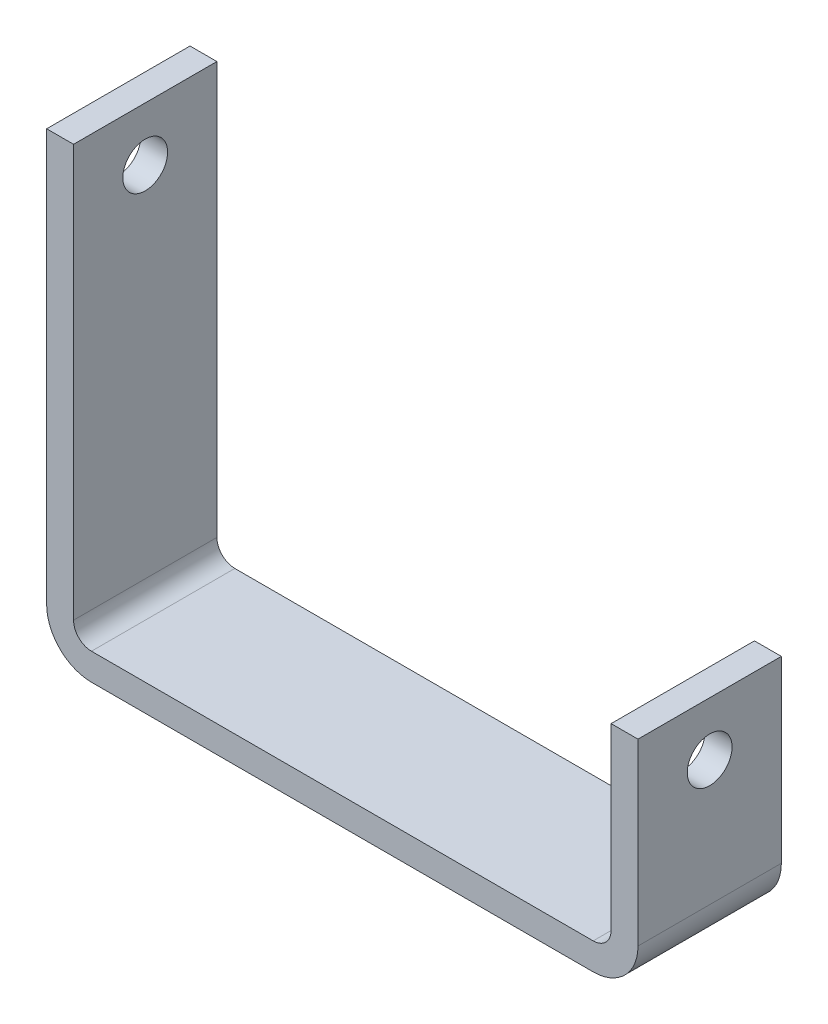
ISO-10303-21;
HEADER;
FILE_DESCRIPTION(('STEP AP214'),'2;1');
FILE_NAME('part.step','',(''),(''),'','','');
FILE_SCHEMA(('AUTOMOTIVE_DESIGN { 1 0 10303 214 1 1 1 1 }'));
ENDSEC;
DATA;
#1=APPLICATION_CONTEXT('core data for automotive mechanical design processes');
#2=APPLICATION_PROTOCOL_DEFINITION('international standard','automotive_design',2000,#1);
#3=PRODUCT_CONTEXT('',#1,'mechanical');
#4=PRODUCT('Part','Part','',(#3));
#5=PRODUCT_RELATED_PRODUCT_CATEGORY('part','',(#4));
#6=PRODUCT_DEFINITION_FORMATION('','',#4);
#7=PRODUCT_DEFINITION_CONTEXT('part definition',#1,'design');
#8=PRODUCT_DEFINITION('design','',#6,#7);
#9=PRODUCT_DEFINITION_SHAPE('','',#8);
#10=(LENGTH_UNIT() NAMED_UNIT(*) SI_UNIT(.MILLI.,.METRE.));
#11=(NAMED_UNIT(*) PLANE_ANGLE_UNIT() SI_UNIT($,.RADIAN.));
#12=(NAMED_UNIT(*) SI_UNIT($,.STERADIAN.) SOLID_ANGLE_UNIT());
#13=UNCERTAINTY_MEASURE_WITH_UNIT(LENGTH_MEASURE(1.E-05),#10,'distance_accuracy_value','');
#14=(GEOMETRIC_REPRESENTATION_CONTEXT(3) GLOBAL_UNCERTAINTY_ASSIGNED_CONTEXT((#13)) GLOBAL_UNIT_ASSIGNED_CONTEXT((#10,
#11,#12)) REPRESENTATION_CONTEXT('',''));
#15=CARTESIAN_POINT('',(0.,0.,0.));
#16=DIRECTION('',(0.,0.,1.));
#17=DIRECTION('',(1.,0.,0.));
#18=AXIS2_PLACEMENT_3D('',#15,#16,#17);
#19=CARTESIAN_POINT('',(0.,5.,20.));
#20=DIRECTION('',(-1.,0.,0.));
#21=DIRECTION('',(0.,0.,1.));
#22=AXIS2_PLACEMENT_3D('',#19,#20,#21);
#23=PLANE('',#22);
#24=CARTESIAN_POINT('',(0.,105.,0.));
#25=DIRECTION('',(-1.,0.,0.));
#26=DIRECTION('',(0.,0.,1.));
#27=AXIS2_PLACEMENT_3D('',#24,#25,#26);
#28=CIRCLE('',#27,6.25);
#29=CARTESIAN_POINT('',(0.,105.,-6.25));
#30=VERTEX_POINT('',#29);
#31=EDGE_CURVE('E266',#30,#30,#28,.T.);
#32=ORIENTED_EDGE('',*,*,#31,.T.);
#33=EDGE_LOOP('',(#32));
#34=FACE_BOUND('',#33,.T.);
#35=DIRECTION('',(0.,1.,0.));
#36=VECTOR('',#35,1.);
#37=CARTESIAN_POINT('',(0.,5.,-20.));
#38=LINE('',#37,#36);
#39=CARTESIAN_POINT('',(0.,5.,-20.));
#40=VERTEX_POINT('',#39);
#41=CARTESIAN_POINT('',(0.,120.,-20.));
#42=VERTEX_POINT('',#41);
#43=EDGE_CURVE('E154',#40,#42,#38,.T.);
#44=ORIENTED_EDGE('',*,*,#43,.T.);
#45=DIRECTION('',(0.,0.,-1.));
#46=VECTOR('',#45,1.);
#47=CARTESIAN_POINT('',(0.,120.,20.));
#48=LINE('',#47,#46);
#49=CARTESIAN_POINT('',(0.,120.,20.));
#50=VERTEX_POINT('',#49);
#51=EDGE_CURVE('E11',#50,#42,#48,.T.);
#52=ORIENTED_EDGE('',*,*,#51,.F.);
#53=DIRECTION('',(0.,1.,0.));
#54=VECTOR('',#53,1.);
#55=CARTESIAN_POINT('',(0.,5.,20.));
#56=LINE('',#55,#54);
#57=CARTESIAN_POINT('',(0.,5.,20.));
#58=VERTEX_POINT('',#57);
#59=EDGE_CURVE('E102',#58,#50,#56,.T.);
#60=ORIENTED_EDGE('',*,*,#59,.F.);
#61=DIRECTION('',(0.,0.,-1.));
#62=VECTOR('',#61,1.);
#63=CARTESIAN_POINT('',(0.,5.,20.));
#64=LINE('',#63,#62);
#65=EDGE_CURVE('E150',#58,#40,#64,.T.);
#66=ORIENTED_EDGE('',*,*,#65,.T.);
#67=EDGE_LOOP('',(#44,#52,#60,#66));
#68=FACE_BOUND('',#67,.T.);
#69=ADVANCED_FACE('F34',(#34,#68),#23,.F.);
#70=CARTESIAN_POINT('',(-7.5,120.,20.));
#71=DIRECTION('',(0.,1.,0.));
#72=DIRECTION('',(0.,0.,1.));
#73=AXIS2_PLACEMENT_3D('',#70,#71,#72);
#74=PLANE('',#73);
#75=DIRECTION('',(1.,0.,0.));
#76=VECTOR('',#75,1.);
#77=CARTESIAN_POINT('',(-7.5,120.,-20.));
#78=LINE('',#77,#76);
#79=CARTESIAN_POINT('',(-7.5,120.,-20.));
#80=VERTEX_POINT('',#79);
#81=EDGE_CURVE('E157',#80,#42,#78,.T.);
#82=ORIENTED_EDGE('',*,*,#81,.F.);
#83=DIRECTION('',(0.,0.,-1.));
#84=VECTOR('',#83,1.);
#85=CARTESIAN_POINT('',(-7.5,120.,20.));
#86=LINE('',#85,#84);
#87=CARTESIAN_POINT('',(-7.5,120.,20.));
#88=VERTEX_POINT('',#87);
#89=EDGE_CURVE('E42',#88,#80,#86,.T.);
#90=ORIENTED_EDGE('',*,*,#89,.F.);
#91=DIRECTION('',(1.,0.,0.));
#92=VECTOR('',#91,1.);
#93=CARTESIAN_POINT('',(-7.5,120.,20.));
#94=LINE('',#93,#92);
#95=EDGE_CURVE('E220',#88,#50,#94,.T.);
#96=ORIENTED_EDGE('',*,*,#95,.T.);
#97=ORIENTED_EDGE('',*,*,#51,.T.);
#98=EDGE_LOOP('',(#82,#90,#96,#97));
#99=FACE_BOUND('',#98,.T.);
#100=ADVANCED_FACE('F207',(#99),#74,.T.);
#101=CARTESIAN_POINT('',(-7.5,5.,20.));
#102=DIRECTION('',(-1.,0.,0.));
#103=DIRECTION('',(0.,0.,1.));
#104=AXIS2_PLACEMENT_3D('',#101,#102,#103);
#105=PLANE('',#104);
#106=CARTESIAN_POINT('',(-7.5,105.,0.));
#107=DIRECTION('',(-1.,0.,0.));
#108=DIRECTION('',(0.,0.,1.));
#109=AXIS2_PLACEMENT_3D('',#106,#107,#108);
#110=CIRCLE('',#109,6.25);
#111=CARTESIAN_POINT('',(-7.5,105.,-6.25));
#112=VERTEX_POINT('',#111);
#113=EDGE_CURVE('E158',#112,#112,#110,.T.);
#114=ORIENTED_EDGE('',*,*,#113,.F.);
#115=EDGE_LOOP('',(#114));
#116=FACE_BOUND('',#115,.T.);
#117=DIRECTION('',(0.,1.,0.));
#118=VECTOR('',#117,1.);
#119=CARTESIAN_POINT('',(-7.5,5.,-20.));
#120=LINE('',#119,#118);
#121=CARTESIAN_POINT('',(-7.5,5.,-20.));
#122=VERTEX_POINT('',#121);
#123=EDGE_CURVE('E161',#122,#80,#120,.T.);
#124=ORIENTED_EDGE('',*,*,#123,.F.);
#125=DIRECTION('',(0.,0.,-1.));
#126=VECTOR('',#125,1.);
#127=CARTESIAN_POINT('',(-7.5,5.,20.));
#128=LINE('',#127,#126);
#129=CARTESIAN_POINT('',(-7.5,5.,20.));
#130=VERTEX_POINT('',#129);
#131=EDGE_CURVE('E197',#130,#122,#128,.T.);
#132=ORIENTED_EDGE('',*,*,#131,.F.);
#133=DIRECTION('',(0.,1.,0.));
#134=VECTOR('',#133,1.);
#135=CARTESIAN_POINT('',(-7.5,5.,20.));
#136=LINE('',#135,#134);
#137=EDGE_CURVE('E204',#130,#88,#136,.T.);
#138=ORIENTED_EDGE('',*,*,#137,.T.);
#139=ORIENTED_EDGE('',*,*,#89,.T.);
#140=EDGE_LOOP('',(#124,#132,#138,#139));
#141=FACE_BOUND('',#140,.T.);
#142=ADVANCED_FACE('F202',(#116,#141),#105,.T.);
#143=CARTESIAN_POINT('',(5.,5.,20.));
#144=DIRECTION('',(0.,0.,-1.));
#145=DIRECTION('',(-1.,0.,0.));
#146=AXIS2_PLACEMENT_3D('',#143,#144,#145);
#147=CYLINDRICAL_SURFACE('',#146,12.5);
#148=CARTESIAN_POINT('',(5.,5.,-20.));
#149=DIRECTION('',(0.,0.,1.));
#150=DIRECTION('',(1.,0.,0.));
#151=AXIS2_PLACEMENT_3D('',#148,#149,#150);
#152=CIRCLE('',#151,12.5);
#153=CARTESIAN_POINT('',(5.,-7.5,-20.));
#154=VERTEX_POINT('',#153);
#155=EDGE_CURVE('E164',#154,#122,#152,.F.);
#156=ORIENTED_EDGE('',*,*,#155,.F.);
#157=DIRECTION('',(0.,0.,-1.));
#158=VECTOR('',#157,1.);
#159=CARTESIAN_POINT('',(5.,-7.5,20.));
#160=LINE('',#159,#158);
#161=CARTESIAN_POINT('',(5.,-7.5,20.));
#162=VERTEX_POINT('',#161);
#163=EDGE_CURVE('E195',#162,#154,#160,.T.);
#164=ORIENTED_EDGE('',*,*,#163,.F.);
#165=CARTESIAN_POINT('',(5.,5.,20.));
#166=DIRECTION('',(0.,0.,1.));
#167=DIRECTION('',(1.,0.,0.));
#168=AXIS2_PLACEMENT_3D('',#165,#166,#167);
#169=CIRCLE('',#168,12.5);
#170=EDGE_CURVE('E217',#162,#130,#169,.F.);
#171=ORIENTED_EDGE('',*,*,#170,.T.);
#172=ORIENTED_EDGE('',*,*,#131,.T.);
#173=EDGE_LOOP('',(#156,#164,#171,#172));
#174=FACE_BOUND('',#173,.T.);
#175=ADVANCED_FACE('F214',(#174),#147,.T.);
#176=CARTESIAN_POINT('',(5.,-7.5,20.));
#177=DIRECTION('',(0.,-1.,0.));
#178=DIRECTION('',(0.,0.,-1.));
#179=AXIS2_PLACEMENT_3D('',#176,#177,#178);
#180=PLANE('',#179);
#181=DIRECTION('',(1.,0.,0.));
#182=VECTOR('',#181,1.);
#183=CARTESIAN_POINT('',(5.,-7.5,-20.));
#184=LINE('',#183,#182);
#185=CARTESIAN_POINT('',(145.,-7.5,-20.));
#186=VERTEX_POINT('',#185);
#187=EDGE_CURVE('E167',#186,#154,#184,.F.);
#188=ORIENTED_EDGE('',*,*,#187,.F.);
#189=DIRECTION('',(0.,0.,-1.));
#190=VECTOR('',#189,1.);
#191=CARTESIAN_POINT('',(145.,-7.5,20.));
#192=LINE('',#191,#190);
#193=CARTESIAN_POINT('',(145.,-7.5,20.));
#194=VERTEX_POINT('',#193);
#195=EDGE_CURVE('E193',#194,#186,#192,.T.);
#196=ORIENTED_EDGE('',*,*,#195,.F.);
#197=DIRECTION('',(1.,0.,0.));
#198=VECTOR('',#197,1.);
#199=CARTESIAN_POINT('',(5.,-7.5,20.));
#200=LINE('',#199,#198);
#201=EDGE_CURVE('E222',#194,#162,#200,.F.);
#202=ORIENTED_EDGE('',*,*,#201,.T.);
#203=ORIENTED_EDGE('',*,*,#163,.T.);
#204=EDGE_LOOP('',(#188,#196,#202,#203));
#205=FACE_BOUND('',#204,.T.);
#206=ADVANCED_FACE('F307',(#205),#180,.T.);
#207=CARTESIAN_POINT('',(145.,5.,20.));
#208=DIRECTION('',(0.,0.,-1.));
#209=DIRECTION('',(-1.,0.,0.));
#210=AXIS2_PLACEMENT_3D('',#207,#208,#209);
#211=CYLINDRICAL_SURFACE('',#210,12.5);
#212=CARTESIAN_POINT('',(145.,5.,-20.));
#213=DIRECTION('',(0.,0.,1.));
#214=DIRECTION('',(1.,0.,0.));
#215=AXIS2_PLACEMENT_3D('',#212,#213,#214);
#216=CIRCLE('',#215,12.5);
#217=CARTESIAN_POINT('',(157.5,5.,-20.));
#218=VERTEX_POINT('',#217);
#219=EDGE_CURVE('E170',#218,#186,#216,.F.);
#220=ORIENTED_EDGE('',*,*,#219,.F.);
#221=DIRECTION('',(0.,0.,-1.));
#222=VECTOR('',#221,1.);
#223=CARTESIAN_POINT('',(157.5,5.,20.));
#224=LINE('',#223,#222);
#225=CARTESIAN_POINT('',(157.5,5.,20.));
#226=VERTEX_POINT('',#225);
#227=EDGE_CURVE('E191',#226,#218,#224,.T.);
#228=ORIENTED_EDGE('',*,*,#227,.F.);
#229=CARTESIAN_POINT('',(145.,5.,20.));
#230=DIRECTION('',(0.,0.,1.));
#231=DIRECTION('',(1.,0.,0.));
#232=AXIS2_PLACEMENT_3D('',#229,#230,#231);
#233=CIRCLE('',#232,12.5);
#234=EDGE_CURVE('E228',#226,#194,#233,.F.);
#235=ORIENTED_EDGE('',*,*,#234,.T.);
#236=ORIENTED_EDGE('',*,*,#195,.T.);
#237=EDGE_LOOP('',(#220,#228,#235,#236));
#238=FACE_BOUND('',#237,.T.);
#239=ADVANCED_FACE('F312',(#238),#211,.T.);
#240=CARTESIAN_POINT('',(157.5,4.99999999999998,20.));
#241=DIRECTION('',(1.,0.,0.));
#242=DIRECTION('',(0.,1.,0.));
#243=AXIS2_PLACEMENT_3D('',#240,#241,#242);
#244=PLANE('',#243);
#245=CARTESIAN_POINT('',(157.5,39.9999999999999,0.));
#246=DIRECTION('',(1.,0.,0.));
#247=DIRECTION('',(0.,1.,0.));
#248=AXIS2_PLACEMENT_3D('',#245,#246,#247);
#249=CIRCLE('',#248,6.25);
#250=CARTESIAN_POINT('',(157.5,46.2499999999999,0.));
#251=VERTEX_POINT('',#250);
#252=EDGE_CURVE('E291',#251,#251,#249,.T.);
#253=ORIENTED_EDGE('',*,*,#252,.F.);
#254=EDGE_LOOP('',(#253));
#255=FACE_BOUND('',#254,.T.);
#256=DIRECTION('',(0.,-1.,0.));
#257=VECTOR('',#256,1.);
#258=CARTESIAN_POINT('',(157.5,4.99999999999998,-20.));
#259=LINE('',#258,#257);
#260=CARTESIAN_POINT('',(157.5,54.9999999999999,-20.));
#261=VERTEX_POINT('',#260);
#262=EDGE_CURVE('E173',#261,#218,#259,.T.);
#263=ORIENTED_EDGE('',*,*,#262,.F.);
#264=DIRECTION('',(0.,0.,-1.));
#265=VECTOR('',#264,1.);
#266=CARTESIAN_POINT('',(157.5,54.9999999999999,20.));
#267=LINE('',#266,#265);
#268=CARTESIAN_POINT('',(157.5,54.9999999999999,20.));
#269=VERTEX_POINT('',#268);
#270=EDGE_CURVE('E189',#269,#261,#267,.T.);
#271=ORIENTED_EDGE('',*,*,#270,.F.);
#272=DIRECTION('',(0.,-1.,0.));
#273=VECTOR('',#272,1.);
#274=CARTESIAN_POINT('',(157.5,4.99999999999998,20.));
#275=LINE('',#274,#273);
#276=EDGE_CURVE('E231',#269,#226,#275,.T.);
#277=ORIENTED_EDGE('',*,*,#276,.T.);
#278=ORIENTED_EDGE('',*,*,#227,.T.);
#279=EDGE_LOOP('',(#263,#271,#277,#278));
#280=FACE_BOUND('',#279,.T.);
#281=ADVANCED_FACE('F243',(#255,#280),#244,.T.);
#282=CARTESIAN_POINT('',(150.,54.9999999999999,20.));
#283=DIRECTION('',(0.,1.,0.));
#284=DIRECTION('',(-1.,0.,0.));
#285=AXIS2_PLACEMENT_3D('',#282,#283,#284);
#286=PLANE('',#285);
#287=DIRECTION('',(1.,0.,0.));
#288=VECTOR('',#287,1.);
#289=CARTESIAN_POINT('',(150.,54.9999999999999,-20.));
#290=LINE('',#289,#288);
#291=CARTESIAN_POINT('',(150.,54.9999999999999,-20.));
#292=VERTEX_POINT('',#291);
#293=EDGE_CURVE('E176',#292,#261,#290,.T.);
#294=ORIENTED_EDGE('',*,*,#293,.F.);
#295=DIRECTION('',(0.,0.,-1.));
#296=VECTOR('',#295,1.);
#297=CARTESIAN_POINT('',(150.,54.9999999999999,20.));
#298=LINE('',#297,#296);
#299=CARTESIAN_POINT('',(150.,54.9999999999999,20.));
#300=VERTEX_POINT('',#299);
#301=EDGE_CURVE('E187',#300,#292,#298,.T.);
#302=ORIENTED_EDGE('',*,*,#301,.F.);
#303=DIRECTION('',(1.,0.,0.));
#304=VECTOR('',#303,1.);
#305=CARTESIAN_POINT('',(150.,54.9999999999999,20.));
#306=LINE('',#305,#304);
#307=EDGE_CURVE('E234',#300,#269,#306,.T.);
#308=ORIENTED_EDGE('',*,*,#307,.T.);
#309=ORIENTED_EDGE('',*,*,#270,.T.);
#310=EDGE_LOOP('',(#294,#302,#308,#309));
#311=FACE_BOUND('',#310,.T.);
#312=ADVANCED_FACE('F238',(#311),#286,.T.);
#313=CARTESIAN_POINT('',(150.,5.,20.));
#314=DIRECTION('',(1.,0.,0.));
#315=DIRECTION('',(0.,1.,0.));
#316=AXIS2_PLACEMENT_3D('',#313,#314,#315);
#317=PLANE('',#316);
#318=CARTESIAN_POINT('',(150.,39.9999999999999,0.));
#319=DIRECTION('',(1.,0.,0.));
#320=DIRECTION('',(0.,1.,0.));
#321=AXIS2_PLACEMENT_3D('',#318,#319,#320);
#322=CIRCLE('',#321,6.25);
#323=CARTESIAN_POINT('',(150.,46.2499999999999,0.));
#324=VERTEX_POINT('',#323);
#325=EDGE_CURVE('E293',#324,#324,#322,.F.);
#326=ORIENTED_EDGE('',*,*,#325,.F.);
#327=EDGE_LOOP('',(#326));
#328=FACE_BOUND('',#327,.T.);
#329=DIRECTION('',(0.,-1.,0.));
#330=VECTOR('',#329,1.);
#331=CARTESIAN_POINT('',(150.,5.,-20.));
#332=LINE('',#331,#330);
#333=CARTESIAN_POINT('',(150.,5.,-20.));
#334=VERTEX_POINT('',#333);
#335=EDGE_CURVE('E179',#292,#334,#332,.T.);
#336=ORIENTED_EDGE('',*,*,#335,.T.);
#337=DIRECTION('',(0.,0.,-1.));
#338=VECTOR('',#337,1.);
#339=CARTESIAN_POINT('',(150.,5.,20.));
#340=LINE('',#339,#338);
#341=CARTESIAN_POINT('',(150.,5.,20.));
#342=VERTEX_POINT('',#341);
#343=EDGE_CURVE('E145',#342,#334,#340,.T.);
#344=ORIENTED_EDGE('',*,*,#343,.F.);
#345=DIRECTION('',(0.,-1.,0.));
#346=VECTOR('',#345,1.);
#347=CARTESIAN_POINT('',(150.,5.,20.));
#348=LINE('',#347,#346);
#349=EDGE_CURVE('E136',#300,#342,#348,.T.);
#350=ORIENTED_EDGE('',*,*,#349,.F.);
#351=ORIENTED_EDGE('',*,*,#301,.T.);
#352=EDGE_LOOP('',(#336,#344,#350,#351));
#353=FACE_BOUND('',#352,.T.);
#354=ADVANCED_FACE('F247',(#328,#353),#317,.F.);
#355=CARTESIAN_POINT('',(145.,5.,20.));
#356=DIRECTION('',(0.,0.,-1.));
#357=DIRECTION('',(-1.,0.,0.));
#358=AXIS2_PLACEMENT_3D('',#355,#356,#357);
#359=CYLINDRICAL_SURFACE('',#358,5.);
#360=CARTESIAN_POINT('',(145.,5.,-20.));
#361=DIRECTION('',(0.,0.,-1.));
#362=DIRECTION('',(1.,0.,0.));
#363=AXIS2_PLACEMENT_3D('',#360,#361,#362);
#364=CIRCLE('',#363,5.);
#365=CARTESIAN_POINT('',(145.,0.,-20.));
#366=VERTEX_POINT('',#365);
#367=EDGE_CURVE('E144',#334,#366,#364,.T.);
#368=ORIENTED_EDGE('',*,*,#367,.T.);
#369=DIRECTION('',(0.,0.,-1.));
#370=VECTOR('',#369,1.);
#371=CARTESIAN_POINT('',(145.,0.,20.));
#372=LINE('',#371,#370);
#373=CARTESIAN_POINT('',(145.,0.,20.));
#374=VERTEX_POINT('',#373);
#375=EDGE_CURVE('E141',#374,#366,#372,.T.);
#376=ORIENTED_EDGE('',*,*,#375,.F.);
#377=CARTESIAN_POINT('',(145.,5.,20.));
#378=DIRECTION('',(0.,0.,-1.));
#379=DIRECTION('',(1.,0.,0.));
#380=AXIS2_PLACEMENT_3D('',#377,#378,#379);
#381=CIRCLE('',#380,5.);
#382=EDGE_CURVE('E129',#342,#374,#381,.T.);
#383=ORIENTED_EDGE('',*,*,#382,.F.);
#384=ORIENTED_EDGE('',*,*,#343,.T.);
#385=EDGE_LOOP('',(#368,#376,#383,#384));
#386=FACE_BOUND('',#385,.T.);
#387=ADVANCED_FACE('F142',(#386),#359,.F.);
#388=CARTESIAN_POINT('',(5.,0.,20.));
#389=DIRECTION('',(0.,-1.,0.));
#390=DIRECTION('',(0.,0.,-1.));
#391=AXIS2_PLACEMENT_3D('',#388,#389,#390);
#392=PLANE('',#391);
#393=DIRECTION('',(-1.,0.,0.));
#394=VECTOR('',#393,1.);
#395=CARTESIAN_POINT('',(5.,0.,-20.));
#396=LINE('',#395,#394);
#397=CARTESIAN_POINT('',(5.,0.,-20.));
#398=VERTEX_POINT('',#397);
#399=EDGE_CURVE('E90',#366,#398,#396,.T.);
#400=ORIENTED_EDGE('',*,*,#399,.T.);
#401=DIRECTION('',(0.,0.,-1.));
#402=VECTOR('',#401,1.);
#403=CARTESIAN_POINT('',(5.,0.,20.));
#404=LINE('',#403,#402);
#405=CARTESIAN_POINT('',(5.,0.,20.));
#406=VERTEX_POINT('',#405);
#407=EDGE_CURVE('E146',#406,#398,#404,.T.);
#408=ORIENTED_EDGE('',*,*,#407,.F.);
#409=DIRECTION('',(-1.,0.,0.));
#410=VECTOR('',#409,1.);
#411=CARTESIAN_POINT('',(5.,0.,20.));
#412=LINE('',#411,#410);
#413=EDGE_CURVE('E133',#374,#406,#412,.T.);
#414=ORIENTED_EDGE('',*,*,#413,.F.);
#415=ORIENTED_EDGE('',*,*,#375,.T.);
#416=EDGE_LOOP('',(#400,#408,#414,#415));
#417=FACE_BOUND('',#416,.T.);
#418=ADVANCED_FACE('F148',(#417),#392,.F.);
#419=CARTESIAN_POINT('',(5.,5.,20.));
#420=DIRECTION('',(0.,0.,-1.));
#421=DIRECTION('',(-1.,0.,0.));
#422=AXIS2_PLACEMENT_3D('',#419,#420,#421);
#423=CYLINDRICAL_SURFACE('',#422,5.);
#424=CARTESIAN_POINT('',(5.,5.,-20.));
#425=DIRECTION('',(0.,0.,-1.));
#426=DIRECTION('',(-1.,0.,0.));
#427=AXIS2_PLACEMENT_3D('',#424,#425,#426);
#428=CIRCLE('',#427,5.);
#429=EDGE_CURVE('E96',#398,#40,#428,.T.);
#430=ORIENTED_EDGE('',*,*,#429,.T.);
#431=ORIENTED_EDGE('',*,*,#65,.F.);
#432=CARTESIAN_POINT('',(5.,5.,20.));
#433=DIRECTION('',(0.,0.,-1.));
#434=DIRECTION('',(-1.,0.,0.));
#435=AXIS2_PLACEMENT_3D('',#432,#433,#434);
#436=CIRCLE('',#435,5.);
#437=EDGE_CURVE('E50',#406,#58,#436,.T.);
#438=ORIENTED_EDGE('',*,*,#437,.F.);
#439=ORIENTED_EDGE('',*,*,#407,.T.);
#440=EDGE_LOOP('',(#430,#431,#438,#439));
#441=FACE_BOUND('',#440,.T.);
#442=ADVANCED_FACE('F267',(#441),#423,.F.);
#443=CARTESIAN_POINT('',(5.,5.,20.));
#444=DIRECTION('',(0.,0.,1.));
#445=DIRECTION('',(1.,0.,0.));
#446=AXIS2_PLACEMENT_3D('',#443,#444,#445);
#447=PLANE('',#446);
#448=ORIENTED_EDGE('',*,*,#59,.T.);
#449=ORIENTED_EDGE('',*,*,#95,.F.);
#450=ORIENTED_EDGE('',*,*,#137,.F.);
#451=ORIENTED_EDGE('',*,*,#170,.F.);
#452=ORIENTED_EDGE('',*,*,#201,.F.);
#453=ORIENTED_EDGE('',*,*,#234,.F.);
#454=ORIENTED_EDGE('',*,*,#276,.F.);
#455=ORIENTED_EDGE('',*,*,#307,.F.);
#456=ORIENTED_EDGE('',*,*,#349,.T.);
#457=ORIENTED_EDGE('',*,*,#382,.T.);
#458=ORIENTED_EDGE('',*,*,#413,.T.);
#459=ORIENTED_EDGE('',*,*,#437,.T.);
#460=EDGE_LOOP('',(#448,#449,#450,#451,#452,#453,#454,#455,#456,#457,#458,#459));
#461=FACE_BOUND('',#460,.T.);
#462=ADVANCED_FACE('F131',(#461),#447,.T.);
#463=CARTESIAN_POINT('',(5.,5.,-20.));
#464=DIRECTION('',(0.,0.,1.));
#465=DIRECTION('',(1.,0.,0.));
#466=AXIS2_PLACEMENT_3D('',#463,#464,#465);
#467=PLANE('',#466);
#468=ORIENTED_EDGE('',*,*,#43,.F.);
#469=ORIENTED_EDGE('',*,*,#429,.F.);
#470=ORIENTED_EDGE('',*,*,#399,.F.);
#471=ORIENTED_EDGE('',*,*,#367,.F.);
#472=ORIENTED_EDGE('',*,*,#335,.F.);
#473=ORIENTED_EDGE('',*,*,#293,.T.);
#474=ORIENTED_EDGE('',*,*,#262,.T.);
#475=ORIENTED_EDGE('',*,*,#219,.T.);
#476=ORIENTED_EDGE('',*,*,#187,.T.);
#477=ORIENTED_EDGE('',*,*,#155,.T.);
#478=ORIENTED_EDGE('',*,*,#123,.T.);
#479=ORIENTED_EDGE('',*,*,#81,.T.);
#480=EDGE_LOOP('',(#468,#469,#470,#471,#472,#473,#474,#475,#476,#477,#478,#479));
#481=FACE_BOUND('',#480,.T.);
#482=ADVANCED_FACE('F210',(#481),#467,.F.);
#483=CARTESIAN_POINT('',(-7.501,105.,0.));
#484=DIRECTION('',(1.,0.,0.));
#485=DIRECTION('',(0.,0.,-1.));
#486=AXIS2_PLACEMENT_3D('',#483,#484,#485);
#487=CYLINDRICAL_SURFACE('',#486,6.25);
#488=CARTESIAN_POINT('',(-7.5,105.,-6.25));
#489=CARTESIAN_POINT('',(-7.421875,105.,-6.25));
#490=CARTESIAN_POINT('',(-7.34375,105.,-6.25));
#491=CARTESIAN_POINT('',(-7.1875,105.,-6.25));
#492=CARTESIAN_POINT('',(-7.109375,105.,-6.25));
#493=CARTESIAN_POINT('',(-6.953125,105.,-6.25));
#494=CARTESIAN_POINT('',(-6.875,105.,-6.25));
#495=CARTESIAN_POINT('',(-6.71875,105.,-6.25));
#496=CARTESIAN_POINT('',(-6.64062499999999,105.,-6.25));
#497=CARTESIAN_POINT('',(-6.48437499999999,105.,-6.25));
#498=CARTESIAN_POINT('',(-6.40624999999999,105.,-6.25));
#499=CARTESIAN_POINT('',(-6.24999999999999,105.,-6.25));
#500=CARTESIAN_POINT('',(-6.17187499999999,105.,-6.25));
#501=CARTESIAN_POINT('',(-6.01562499999999,105.,-6.25));
#502=CARTESIAN_POINT('',(-5.93749999999999,105.,-6.25));
#503=CARTESIAN_POINT('',(-5.78124999999999,105.,-6.25));
#504=CARTESIAN_POINT('',(-5.70312499999999,105.,-6.25));
#505=CARTESIAN_POINT('',(-5.54687499999999,105.,-6.25));
#506=CARTESIAN_POINT('',(-5.46874999999999,105.,-6.25));
#507=CARTESIAN_POINT('',(-5.31249999999999,105.,-6.25));
#508=CARTESIAN_POINT('',(-5.23437499999999,105.,-6.25));
#509=CARTESIAN_POINT('',(-5.07812499999999,105.,-6.25));
#510=CARTESIAN_POINT('',(-4.99999999999999,105.,-6.25));
#511=CARTESIAN_POINT('',(-4.84374999999999,105.,-6.25));
#512=CARTESIAN_POINT('',(-4.76562499999998,105.,-6.25));
#513=CARTESIAN_POINT('',(-4.60937499999998,105.,-6.25));
#514=CARTESIAN_POINT('',(-4.53124999999998,105.,-6.25));
#515=CARTESIAN_POINT('',(-4.37499999999998,105.,-6.25));
#516=CARTESIAN_POINT('',(-4.29687499999998,105.,-6.25));
#517=CARTESIAN_POINT('',(-4.14062499999998,105.,-6.25));
#518=CARTESIAN_POINT('',(-4.06249999999998,105.,-6.25));
#519=CARTESIAN_POINT('',(-3.90624999999998,105.,-6.25));
#520=CARTESIAN_POINT('',(-3.82812499999998,105.,-6.25));
#521=CARTESIAN_POINT('',(-3.67187499999998,105.,-6.25));
#522=CARTESIAN_POINT('',(-3.59374999999998,105.,-6.25));
#523=CARTESIAN_POINT('',(-3.43749999999998,105.,-6.25));
#524=CARTESIAN_POINT('',(-3.35937499999998,105.,-6.25));
#525=CARTESIAN_POINT('',(-3.20312499999998,105.,-6.25));
#526=CARTESIAN_POINT('',(-3.12499999999998,105.,-6.25));
#527=CARTESIAN_POINT('',(-2.96874999999998,105.,-6.25));
#528=CARTESIAN_POINT('',(-2.89062499999998,105.,-6.25));
#529=CARTESIAN_POINT('',(-2.73437499999997,105.,-6.25));
#530=CARTESIAN_POINT('',(-2.65624999999997,105.,-6.25));
#531=CARTESIAN_POINT('',(-2.49999999999997,105.,-6.25));
#532=CARTESIAN_POINT('',(-2.42187499999997,105.,-6.25));
#533=CARTESIAN_POINT('',(-2.26562499999997,105.,-6.25));
#534=CARTESIAN_POINT('',(-2.18749999999997,105.,-6.25));
#535=CARTESIAN_POINT('',(-2.03124999999997,105.,-6.25));
#536=CARTESIAN_POINT('',(-1.95312499999997,105.,-6.25));
#537=CARTESIAN_POINT('',(-1.79687499999997,105.,-6.25));
#538=CARTESIAN_POINT('',(-1.71874999999997,105.,-6.25));
#539=CARTESIAN_POINT('',(-1.56249999999997,105.,-6.25));
#540=CARTESIAN_POINT('',(-1.48437499999997,105.,-6.25));
#541=CARTESIAN_POINT('',(-1.32812499999997,105.,-6.25));
#542=CARTESIAN_POINT('',(-1.24999999999997,105.,-6.25));
#543=CARTESIAN_POINT('',(-1.09374999999997,105.,-6.25));
#544=CARTESIAN_POINT('',(-1.01562499999997,105.,-6.25));
#545=CARTESIAN_POINT('',(-0.859374999999965,105.,-6.25));
#546=CARTESIAN_POINT('',(-0.781249999999964,105.,-6.25));
#547=CARTESIAN_POINT('',(-0.624999999999964,105.,-6.25));
#548=CARTESIAN_POINT('',(-0.546874999999963,105.,-6.25));
#549=CARTESIAN_POINT('',(-0.390624999999962,105.,-6.25));
#550=CARTESIAN_POINT('',(-0.312499999999962,105.,-6.25));
#551=CARTESIAN_POINT('',(-0.156249999999961,105.,-6.25));
#552=CARTESIAN_POINT('',(-0.0781249999999604,105.,-6.25));
#553=CARTESIAN_POINT('',(0.,105.,-6.25));
#554=B_SPLINE_CURVE_WITH_KNOTS('',3,(#488,#489,#490,#491,#492,#493,#494,#495,#496,#497,#498,
#499,#500,#501,#502,#503,#504,#505,#506,#507,#508,#509,#510,#511,#512,#513,#514,#515,#516,#517,
#518,#519,#520,#521,#522,#523,#524,#525,#526,#527,#528,#529,#530,#531,#532,#533,#534,#535,#536,
#537,#538,#539,#540,#541,#542,#543,#544,#545,#546,#547,#548,#549,#550,#551,#552,#553),
.UNSPECIFIED.,.F.,.F.,(4,2,2,2,2,2,2,2,2,2,2,2,2,2,2,2,2,2,2,2,2,2,2,2,2,2,2,2,2,2,2,2,4),(0.,
0.234375000000001,0.468750000000002,0.703125000000003,0.937500000000004,1.17187500000001,
1.40625000000001,1.64062500000001,1.87500000000001,2.10937500000001,2.34375000000001,
2.57812500000001,2.81250000000001,3.04687500000002,3.28125000000002,3.51562500000002,
3.75000000000002,3.98437500000002,4.21875000000002,4.45312500000002,4.68750000000002,
4.92187500000002,5.15625000000003,5.39062500000003,5.62500000000003,5.85937500000003,
6.09375000000003,6.32812500000003,6.56250000000003,6.79687500000003,7.03125000000004,
7.26562500000004,7.50000000000004),.UNSPECIFIED.);
#555=EDGE_CURVE('BSEAM278',#112,#30,#554,.T.);
#556=ORIENTED_EDGE('',*,*,#113,.T.);
#557=ORIENTED_EDGE('',*,*,#31,.F.);
#558=ORIENTED_EDGE('',*,*,#555,.T.);
#559=ORIENTED_EDGE('',*,*,#555,.F.);
#560=EDGE_LOOP('',(#556,#558,#557,#559));
#561=FACE_BOUND('',#560,.T.);
#562=ADVANCED_FACE('F278',(#561),#487,.F.);
#563=CARTESIAN_POINT('',(-7.5010000000002,40.0000000000003,0.));
#564=DIRECTION('',(1.,0.,0.));
#565=DIRECTION('',(0.,1.,0.));
#566=AXIS2_PLACEMENT_3D('',#563,#564,#565);
#567=CYLINDRICAL_SURFACE('',#566,6.25);
#568=ORIENTED_EDGE('',*,*,#252,.T.);
#569=EDGE_LOOP('',(#568));
#570=FACE_BOUND('',#569,.T.);
#571=ORIENTED_EDGE('',*,*,#325,.T.);
#572=EDGE_LOOP('',(#571));
#573=FACE_BOUND('',#572,.T.);
#574=ADVANCED_FACE('F282',(#570,#573),#567,.F.);
#575=CLOSED_SHELL('',(#69,#100,#142,#175,#206,#239,#281,#312,#354,#387,#418,#442,#462,#482,#562,#574));
#576=MANIFOLD_SOLID_BREP('B2',#575);
#577=ADVANCED_BREP_SHAPE_REPRESENTATION('',(#18,#576),#14);
#578=SHAPE_DEFINITION_REPRESENTATION(#9,#577);
ENDSEC;
END-ISO-10303-21;
